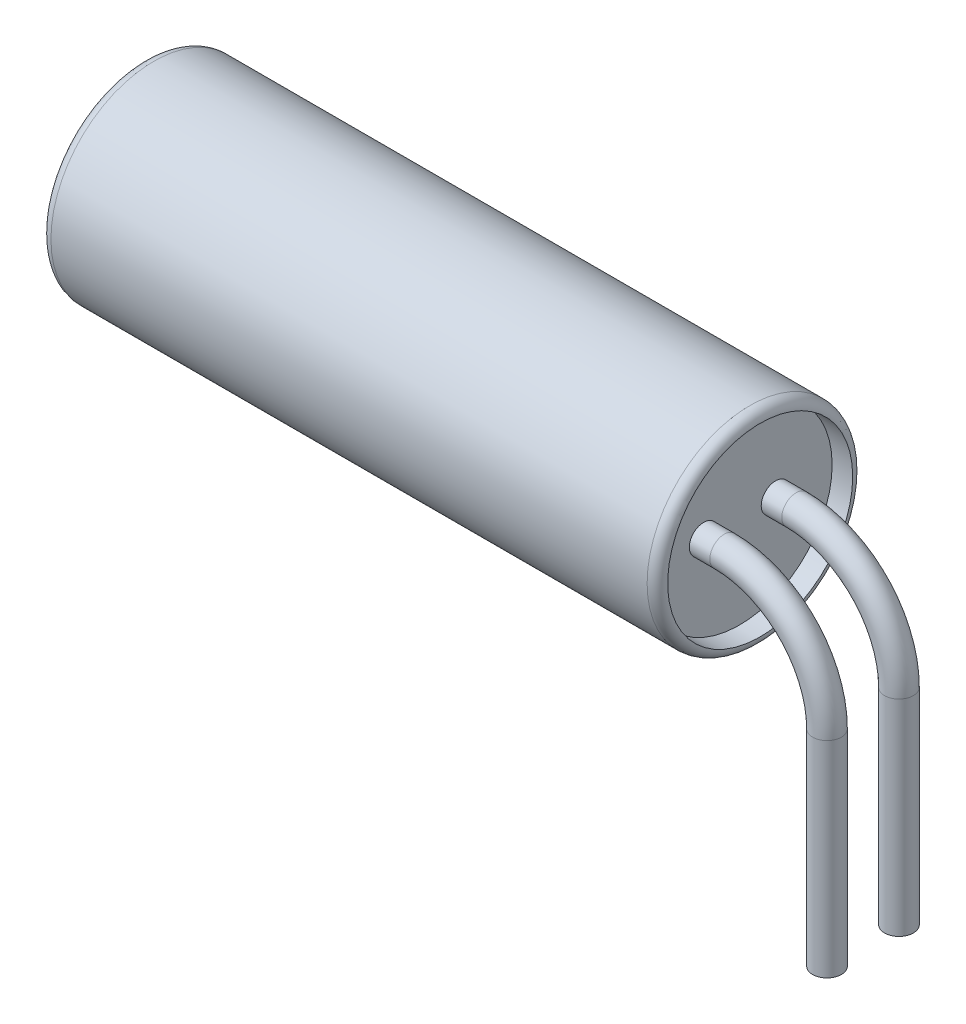
ISO-10303-21;
HEADER;
FILE_DESCRIPTION(('STEP AP214'),'2;1');
FILE_NAME('part.step','',(''),(''),'','','');
FILE_SCHEMA(('AUTOMOTIVE_DESIGN { 1 0 10303 214 1 1 1 1 }'));
ENDSEC;
DATA;
#1=APPLICATION_CONTEXT('core data for automotive mechanical design processes');
#2=APPLICATION_PROTOCOL_DEFINITION('international standard','automotive_design',2000,#1);
#3=PRODUCT_CONTEXT('',#1,'mechanical');
#4=PRODUCT('Part','Part','',(#3));
#5=PRODUCT_RELATED_PRODUCT_CATEGORY('part','',(#4));
#6=PRODUCT_DEFINITION_FORMATION('','',#4);
#7=PRODUCT_DEFINITION_CONTEXT('part definition',#1,'design');
#8=PRODUCT_DEFINITION('design','',#6,#7);
#9=PRODUCT_DEFINITION_SHAPE('','',#8);
#10=(LENGTH_UNIT() NAMED_UNIT(*) SI_UNIT(.MILLI.,.METRE.));
#11=(NAMED_UNIT(*) PLANE_ANGLE_UNIT() SI_UNIT($,.RADIAN.));
#12=(NAMED_UNIT(*) SI_UNIT($,.STERADIAN.) SOLID_ANGLE_UNIT());
#13=UNCERTAINTY_MEASURE_WITH_UNIT(LENGTH_MEASURE(1.E-05),#10,'distance_accuracy_value','');
#14=(GEOMETRIC_REPRESENTATION_CONTEXT(3) GLOBAL_UNCERTAINTY_ASSIGNED_CONTEXT((#13)) GLOBAL_UNIT_ASSIGNED_CONTEXT((#10,
#11,#12)) REPRESENTATION_CONTEXT('',''));
#15=CARTESIAN_POINT('',(0.,0.,0.));
#16=DIRECTION('',(0.,0.,1.));
#17=DIRECTION('',(1.,0.,0.));
#18=AXIS2_PLACEMENT_3D('',#15,#16,#17);
#19=CARTESIAN_POINT('',(-0.2,0.,0.));
#20=DIRECTION('',(1.,0.,0.));
#21=DIRECTION('',(0.,0.,-1.));
#22=AXIS2_PLACEMENT_3D('',#19,#20,#21);
#23=PLANE('',#22);
#24=CARTESIAN_POINT('',(-0.2,0.,0.35));
#25=DIRECTION('',(1.,0.,0.));
#26=DIRECTION('',(0.,0.,-1.));
#27=AXIS2_PLACEMENT_3D('',#24,#25,#26);
#28=CIRCLE('',#27,0.14);
#29=CARTESIAN_POINT('',(-0.2,0.,0.21));
#30=VERTEX_POINT('',#29);
#31=EDGE_CURVE('E49',#30,#30,#28,.T.);
#32=ORIENTED_EDGE('',*,*,#31,.F.);
#33=EDGE_LOOP('',(#32));
#34=FACE_BOUND('',#33,.T.);
#35=CARTESIAN_POINT('',(-0.2,0.,0.));
#36=DIRECTION('',(1.,0.,0.));
#37=DIRECTION('',(0.,0.,-1.));
#38=AXIS2_PLACEMENT_3D('',#35,#36,#37);
#39=CIRCLE('',#38,0.9);
#40=CARTESIAN_POINT('',(-0.2,0.,-0.9));
#41=VERTEX_POINT('',#40);
#42=EDGE_CURVE('E57',#41,#41,#39,.T.);
#43=ORIENTED_EDGE('',*,*,#42,.T.);
#44=EDGE_LOOP('',(#43));
#45=FACE_BOUND('',#44,.T.);
#46=CARTESIAN_POINT('',(-0.2,0.,-0.35));
#47=DIRECTION('',(1.,0.,0.));
#48=DIRECTION('',(0.,0.,-1.));
#49=AXIS2_PLACEMENT_3D('',#46,#47,#48);
#50=CIRCLE('',#49,0.14);
#51=CARTESIAN_POINT('',(-0.2,0.,-0.49));
#52=VERTEX_POINT('',#51);
#53=EDGE_CURVE('E67',#52,#52,#50,.T.);
#54=ORIENTED_EDGE('',*,*,#53,.F.);
#55=EDGE_LOOP('',(#54));
#56=FACE_BOUND('',#55,.T.);
#57=ADVANCED_FACE('F34',(#34,#45,#56),#23,.T.);
#58=CARTESIAN_POINT('',(-6.,0.,0.));
#59=DIRECTION('',(1.,0.,0.));
#60=DIRECTION('',(0.,0.,-1.));
#61=AXIS2_PLACEMENT_3D('',#58,#59,#60);
#62=CYLINDRICAL_SURFACE('',#61,1.);
#63=CARTESIAN_POINT('',(-0.1,0.,0.));
#64=DIRECTION('',(1.,0.,0.));
#65=DIRECTION('',(0.,0.,-1.));
#66=AXIS2_PLACEMENT_3D('',#63,#64,#65);
#67=CIRCLE('',#66,1.);
#68=CARTESIAN_POINT('',(-0.1,0.,-1.));
#69=VERTEX_POINT('',#68);
#70=EDGE_CURVE('E10',#69,#69,#67,.F.);
#71=ORIENTED_EDGE('',*,*,#70,.T.);
#72=EDGE_LOOP('',(#71));
#73=FACE_BOUND('',#72,.T.);
#74=CARTESIAN_POINT('',(-5.9,0.,0.));
#75=DIRECTION('',(1.,0.,0.));
#76=DIRECTION('',(0.,0.,-1.));
#77=AXIS2_PLACEMENT_3D('',#74,#75,#76);
#78=CIRCLE('',#77,1.);
#79=CARTESIAN_POINT('',(-5.9,0.,-1.));
#80=VERTEX_POINT('',#79);
#81=EDGE_CURVE('E45',#80,#80,#78,.T.);
#82=ORIENTED_EDGE('',*,*,#81,.T.);
#83=EDGE_LOOP('',(#82));
#84=FACE_BOUND('',#83,.T.);
#85=ADVANCED_FACE('F109',(#73,#84),#62,.T.);
#86=CARTESIAN_POINT('',(-6.,0.,0.));
#87=DIRECTION('',(1.,0.,0.));
#88=DIRECTION('',(0.,0.,-1.));
#89=AXIS2_PLACEMENT_3D('',#86,#87,#88);
#90=PLANE('',#89);
#91=CARTESIAN_POINT('',(-6.,0.,0.));
#92=DIRECTION('',(1.,0.,0.));
#93=DIRECTION('',(0.,0.,-1.));
#94=AXIS2_PLACEMENT_3D('',#91,#92,#93);
#95=CIRCLE('',#94,0.9);
#96=CARTESIAN_POINT('',(-6.,0.,-0.9));
#97=VERTEX_POINT('',#96);
#98=EDGE_CURVE('E41',#97,#97,#95,.F.);
#99=ORIENTED_EDGE('',*,*,#98,.T.);
#100=EDGE_LOOP('',(#99));
#101=FACE_BOUND('',#100,.T.);
#102=ADVANCED_FACE('F115',(#101),#90,.F.);
#103=CARTESIAN_POINT('',(-5.8,0.,0.));
#104=DIRECTION('',(1.,0.,0.));
#105=DIRECTION('',(0.,0.,-1.));
#106=AXIS2_PLACEMENT_3D('',#103,#104,#105);
#107=CYLINDRICAL_SURFACE('',#106,0.9);
#108=ORIENTED_EDGE('',*,*,#42,.F.);
#109=EDGE_LOOP('',(#108));
#110=FACE_BOUND('',#109,.T.);
#111=CARTESIAN_POINT('',(0.,0.,0.));
#112=DIRECTION('',(1.,0.,0.));
#113=DIRECTION('',(0.,0.,-1.));
#114=AXIS2_PLACEMENT_3D('',#111,#112,#113);
#115=CIRCLE('',#114,0.9);
#116=CARTESIAN_POINT('',(0.,0.,-0.9));
#117=VERTEX_POINT('',#116);
#118=EDGE_CURVE('E54',#117,#117,#115,.T.);
#119=ORIENTED_EDGE('',*,*,#118,.T.);
#120=EDGE_LOOP('',(#119));
#121=FACE_BOUND('',#120,.T.);
#122=ADVANCED_FACE('F123',(#110,#121),#107,.F.);
#123=CARTESIAN_POINT('',(1.,-1.,-0.35));
#124=DIRECTION('',(0.,-1.,0.));
#125=DIRECTION('',(0.,0.,-1.));
#126=AXIS2_PLACEMENT_3D('',#123,#124,#125);
#127=CYLINDRICAL_SURFACE('',#126,0.14);
#128=CARTESIAN_POINT('',(1.,-1.,-0.35));
#129=DIRECTION('',(0.,-1.,0.));
#130=DIRECTION('',(0.,0.,-1.));
#131=AXIS2_PLACEMENT_3D('',#128,#129,#130);
#132=CIRCLE('',#131,0.14);
#133=CARTESIAN_POINT('',(1.14,-1.,-0.35));
#134=VERTEX_POINT('',#133);
#135=EDGE_CURVE('E63',#134,#134,#132,.T.);
#136=ORIENTED_EDGE('',*,*,#135,.T.);
#137=EDGE_LOOP('',(#136));
#138=FACE_BOUND('',#137,.T.);
#139=CARTESIAN_POINT('',(1.,-3.,-0.35));
#140=DIRECTION('',(0.,-1.,0.));
#141=DIRECTION('',(0.,0.,-1.));
#142=AXIS2_PLACEMENT_3D('',#139,#140,#141);
#143=CIRCLE('',#142,0.14);
#144=CARTESIAN_POINT('',(1.,-3.,-0.49));
#145=VERTEX_POINT('',#144);
#146=EDGE_CURVE('E60',#145,#145,#143,.T.);
#147=ORIENTED_EDGE('',*,*,#146,.F.);
#148=EDGE_LOOP('',(#147));
#149=FACE_BOUND('',#148,.T.);
#150=ADVANCED_FACE('F121',(#138,#149),#127,.T.);
#151=CARTESIAN_POINT('',(0.,-1.,-0.35));
#152=DIRECTION('',(0.,0.,-1.));
#153=DIRECTION('',(-1.,0.,0.));
#154=AXIS2_PLACEMENT_3D('',#151,#152,#153);
#155=TOROIDAL_SURFACE('',#154,1.,0.14);
#156=CARTESIAN_POINT('',(0.,0.,-0.35));
#157=DIRECTION('',(1.,0.,0.));
#158=DIRECTION('',(0.,0.,-1.));
#159=AXIS2_PLACEMENT_3D('',#156,#157,#158);
#160=CIRCLE('',#159,0.14);
#161=CARTESIAN_POINT('',(0.,0.14,-0.35));
#162=VERTEX_POINT('',#161);
#163=EDGE_CURVE('E66',#162,#162,#160,.T.);
#164=CARTESIAN_POINT('',(0.,-1.,-0.35));
#165=DIRECTION('',(0.,0.,-1.));
#166=DIRECTION('',(-1.,0.,0.));
#167=AXIS2_PLACEMENT_3D('',#164,#165,#166);
#168=CIRCLE('',#167,1.14);
#169=EDGE_CURVE('',#162,#134,#168,.T.);
#170=ORIENTED_EDGE('',*,*,#163,.T.);
#171=ORIENTED_EDGE('',*,*,#135,.F.);
#172=ORIENTED_EDGE('',*,*,#169,.T.);
#173=ORIENTED_EDGE('',*,*,#169,.F.);
#174=EDGE_LOOP('',(#170,#172,#171,#173));
#175=FACE_BOUND('',#174,.T.);
#176=ADVANCED_FACE('F143',(#175),#155,.T.);
#177=CARTESIAN_POINT('',(0.,0.,-0.35));
#178=DIRECTION('',(-1.,0.,0.));
#179=DIRECTION('',(0.,0.,1.));
#180=AXIS2_PLACEMENT_3D('',#177,#178,#179);
#181=CYLINDRICAL_SURFACE('',#180,0.14);
#182=ORIENTED_EDGE('',*,*,#163,.F.);
#183=EDGE_LOOP('',(#182));
#184=FACE_BOUND('',#183,.T.);
#185=ORIENTED_EDGE('',*,*,#53,.T.);
#186=EDGE_LOOP('',(#185));
#187=FACE_BOUND('',#186,.T.);
#188=ADVANCED_FACE('F150',(#184,#187),#181,.T.);
#189=CARTESIAN_POINT('',(1.,-3.,-0.35));
#190=DIRECTION('',(0.,-1.,0.));
#191=DIRECTION('',(0.,0.,-1.));
#192=AXIS2_PLACEMENT_3D('',#189,#190,#191);
#193=PLANE('',#192);
#194=ORIENTED_EDGE('',*,*,#146,.T.);
#195=EDGE_LOOP('',(#194));
#196=FACE_BOUND('',#195,.T.);
#197=ADVANCED_FACE('F94',(#196),#193,.T.);
#198=CARTESIAN_POINT('',(1.,-1.,0.35));
#199=DIRECTION('',(0.,-1.,0.));
#200=DIRECTION('',(0.,0.,-1.));
#201=AXIS2_PLACEMENT_3D('',#198,#199,#200);
#202=CYLINDRICAL_SURFACE('',#201,0.14);
#203=CARTESIAN_POINT('',(1.,-1.,0.35));
#204=DIRECTION('',(0.,1.,0.));
#205=DIRECTION('',(0.,0.,1.));
#206=AXIS2_PLACEMENT_3D('',#203,#204,#205);
#207=CIRCLE('',#206,0.14);
#208=CARTESIAN_POINT('',(1.14,-1.,0.35));
#209=VERTEX_POINT('',#208);
#210=EDGE_CURVE('E75',#209,#209,#207,.T.);
#211=ORIENTED_EDGE('',*,*,#210,.F.);
#212=EDGE_LOOP('',(#211));
#213=FACE_BOUND('',#212,.T.);
#214=CARTESIAN_POINT('',(1.,-3.,0.35));
#215=DIRECTION('',(0.,1.,0.));
#216=DIRECTION('',(0.,0.,1.));
#217=AXIS2_PLACEMENT_3D('',#214,#215,#216);
#218=CIRCLE('',#217,0.14);
#219=CARTESIAN_POINT('',(1.,-3.,0.49));
#220=VERTEX_POINT('',#219);
#221=EDGE_CURVE('E70',#220,#220,#218,.T.);
#222=ORIENTED_EDGE('',*,*,#221,.T.);
#223=EDGE_LOOP('',(#222));
#224=FACE_BOUND('',#223,.T.);
#225=ADVANCED_FACE('F88',(#213,#224),#202,.T.);
#226=CARTESIAN_POINT('',(0.,-1.,0.35));
#227=DIRECTION('',(0.,0.,-1.));
#228=DIRECTION('',(-1.,0.,0.));
#229=AXIS2_PLACEMENT_3D('',#226,#227,#228);
#230=TOROIDAL_SURFACE('',#229,1.,0.14);
#231=CARTESIAN_POINT('',(0.,0.,0.35));
#232=DIRECTION('',(-1.,0.,0.));
#233=DIRECTION('',(0.,0.,1.));
#234=AXIS2_PLACEMENT_3D('',#231,#232,#233);
#235=CIRCLE('',#234,0.14);
#236=CARTESIAN_POINT('',(0.,0.14,0.35));
#237=VERTEX_POINT('',#236);
#238=EDGE_CURVE('E78',#237,#237,#235,.T.);
#239=CARTESIAN_POINT('',(0.,-1.,0.35));
#240=DIRECTION('',(0.,0.,-1.));
#241=DIRECTION('',(-1.,0.,0.));
#242=AXIS2_PLACEMENT_3D('',#239,#240,#241);
#243=CIRCLE('',#242,1.14);
#244=EDGE_CURVE('',#237,#209,#243,.T.);
#245=ORIENTED_EDGE('',*,*,#238,.F.);
#246=ORIENTED_EDGE('',*,*,#210,.T.);
#247=ORIENTED_EDGE('',*,*,#244,.T.);
#248=ORIENTED_EDGE('',*,*,#244,.F.);
#249=EDGE_LOOP('',(#245,#247,#246,#248));
#250=FACE_BOUND('',#249,.T.);
#251=ADVANCED_FACE('F85',(#250),#230,.T.);
#252=CARTESIAN_POINT('',(0.,0.,0.35));
#253=DIRECTION('',(-1.,0.,0.));
#254=DIRECTION('',(0.,0.,1.));
#255=AXIS2_PLACEMENT_3D('',#252,#253,#254);
#256=CYLINDRICAL_SURFACE('',#255,0.14);
#257=ORIENTED_EDGE('',*,*,#238,.T.);
#258=EDGE_LOOP('',(#257));
#259=FACE_BOUND('',#258,.T.);
#260=ORIENTED_EDGE('',*,*,#31,.T.);
#261=EDGE_LOOP('',(#260));
#262=FACE_BOUND('',#261,.T.);
#263=ADVANCED_FACE('F82',(#259,#262),#256,.T.);
#264=CARTESIAN_POINT('',(1.,-3.,0.35));
#265=DIRECTION('',(0.,-1.,0.));
#266=DIRECTION('',(0.,0.,1.));
#267=AXIS2_PLACEMENT_3D('',#264,#265,#266);
#268=PLANE('',#267);
#269=ORIENTED_EDGE('',*,*,#221,.F.);
#270=EDGE_LOOP('',(#269));
#271=FACE_BOUND('',#270,.T.);
#272=ADVANCED_FACE('F98',(#271),#268,.T.);
#273=CARTESIAN_POINT('',(-5.9,0.,0.));
#274=DIRECTION('',(1.,0.,0.));
#275=DIRECTION('',(0.,0.,-1.));
#276=AXIS2_PLACEMENT_3D('',#273,#274,#275);
#277=TOROIDAL_SURFACE('',#276,0.9,0.1);
#278=ORIENTED_EDGE('',*,*,#98,.F.);
#279=EDGE_LOOP('',(#278));
#280=FACE_BOUND('',#279,.T.);
#281=ORIENTED_EDGE('',*,*,#81,.F.);
#282=EDGE_LOOP('',(#281));
#283=FACE_BOUND('',#282,.T.);
#284=ADVANCED_FACE('F100',(#280,#283),#277,.T.);
#285=CARTESIAN_POINT('',(-0.1,0.,0.));
#286=DIRECTION('',(1.,0.,0.));
#287=DIRECTION('',(0.,0.,-1.));
#288=AXIS2_PLACEMENT_3D('',#285,#286,#287);
#289=TOROIDAL_SURFACE('',#288,0.9,0.1);
#290=ORIENTED_EDGE('',*,*,#70,.F.);
#291=EDGE_LOOP('',(#290));
#292=FACE_BOUND('',#291,.T.);
#293=ORIENTED_EDGE('',*,*,#118,.F.);
#294=EDGE_LOOP('',(#293));
#295=FACE_BOUND('',#294,.T.);
#296=ADVANCED_FACE('F36',(#292,#295),#289,.T.);
#297=CLOSED_SHELL('',(#57,#85,#102,#122,#150,#176,#188,#197,#225,#251,#263,#272,#284,#296));
#298=MANIFOLD_SOLID_BREP('B2',#297);
#299=ADVANCED_BREP_SHAPE_REPRESENTATION('',(#18,#298),#14);
#300=SHAPE_DEFINITION_REPRESENTATION(#9,#299);
ENDSEC;
END-ISO-10303-21;
